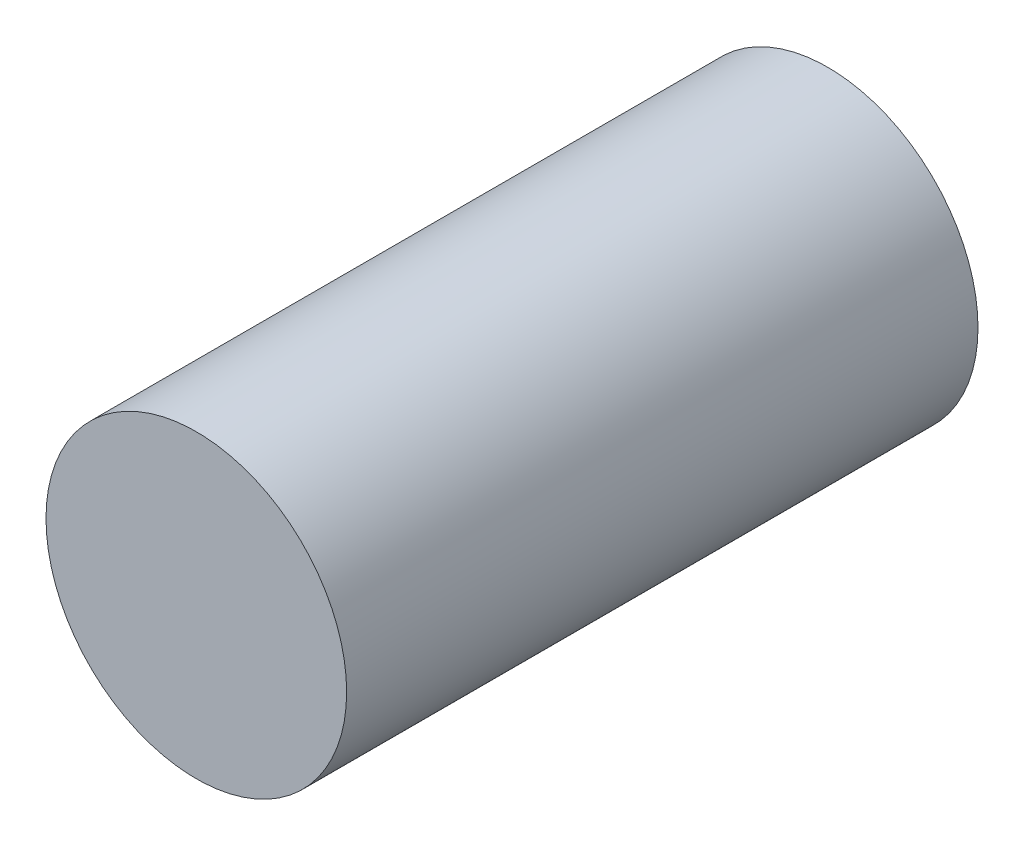
ISO-10303-21;
HEADER;
FILE_DESCRIPTION(('STEP AP214'),'2;1');
FILE_NAME('part.step','',(''),(''),'','','');
FILE_SCHEMA(('AUTOMOTIVE_DESIGN { 1 0 10303 214 1 1 1 1 }'));
ENDSEC;
DATA;
#1=APPLICATION_CONTEXT('core data for automotive mechanical design processes');
#2=APPLICATION_PROTOCOL_DEFINITION('international standard','automotive_design',2000,#1);
#3=PRODUCT_CONTEXT('',#1,'mechanical');
#4=PRODUCT('Part','Part','',(#3));
#5=PRODUCT_RELATED_PRODUCT_CATEGORY('part','',(#4));
#6=PRODUCT_DEFINITION_FORMATION('','',#4);
#7=PRODUCT_DEFINITION_CONTEXT('part definition',#1,'design');
#8=PRODUCT_DEFINITION('design','',#6,#7);
#9=PRODUCT_DEFINITION_SHAPE('','',#8);
#10=(LENGTH_UNIT() NAMED_UNIT(*) SI_UNIT(.MILLI.,.METRE.));
#11=(NAMED_UNIT(*) PLANE_ANGLE_UNIT() SI_UNIT($,.RADIAN.));
#12=(NAMED_UNIT(*) SI_UNIT($,.STERADIAN.) SOLID_ANGLE_UNIT());
#13=UNCERTAINTY_MEASURE_WITH_UNIT(LENGTH_MEASURE(1.E-05),#10,'distance_accuracy_value','');
#14=(GEOMETRIC_REPRESENTATION_CONTEXT(3) GLOBAL_UNCERTAINTY_ASSIGNED_CONTEXT((#13)) GLOBAL_UNIT_ASSIGNED_CONTEXT((#10,
#11,#12)) REPRESENTATION_CONTEXT('',''));
#15=CARTESIAN_POINT('',(0.,0.,0.));
#16=DIRECTION('',(0.,0.,1.));
#17=DIRECTION('',(1.,0.,0.));
#18=AXIS2_PLACEMENT_3D('',#15,#16,#17);
#19=CARTESIAN_POINT('',(0.,0.,31.5));
#20=DIRECTION('',(0.,0.,-1.));
#21=DIRECTION('',(-1.,0.,0.));
#22=AXIS2_PLACEMENT_3D('',#19,#20,#21);
#23=CYLINDRICAL_SURFACE('',#22,7.5);
#24=CARTESIAN_POINT('',(0.,0.,31.5));
#25=DIRECTION('',(0.,0.,1.));
#26=DIRECTION('',(1.,0.,0.));
#27=AXIS2_PLACEMENT_3D('',#24,#25,#26);
#28=CIRCLE('',#27,7.5);
#29=CARTESIAN_POINT('',(7.5,0.,31.5));
#30=VERTEX_POINT('',#29);
#31=EDGE_CURVE('E10',#30,#30,#28,.T.);
#32=ORIENTED_EDGE('',*,*,#31,.F.);
#33=EDGE_LOOP('',(#32));
#34=FACE_BOUND('',#33,.T.);
#35=CARTESIAN_POINT('',(0.,0.,0.));
#36=DIRECTION('',(0.,0.,1.));
#37=DIRECTION('',(1.,0.,0.));
#38=AXIS2_PLACEMENT_3D('',#35,#36,#37);
#39=CIRCLE('',#38,7.5);
#40=CARTESIAN_POINT('',(7.5,0.,0.));
#41=VERTEX_POINT('',#40);
#42=EDGE_CURVE('E48',#41,#41,#39,.T.);
#43=ORIENTED_EDGE('',*,*,#42,.T.);
#44=EDGE_LOOP('',(#43));
#45=FACE_BOUND('',#44,.T.);
#46=ADVANCED_FACE('F45',(#34,#45),#23,.T.);
#47=CARTESIAN_POINT('',(0.,0.,31.5));
#48=DIRECTION('',(0.,0.,1.));
#49=DIRECTION('',(1.,0.,0.));
#50=AXIS2_PLACEMENT_3D('',#47,#48,#49);
#51=PLANE('',#50);
#52=ORIENTED_EDGE('',*,*,#31,.T.);
#53=EDGE_LOOP('',(#52));
#54=FACE_BOUND('',#53,.T.);
#55=ADVANCED_FACE('F62',(#54),#51,.T.);
#56=CARTESIAN_POINT('',(0.,0.,0.));
#57=DIRECTION('',(0.,0.,1.));
#58=DIRECTION('',(1.,0.,0.));
#59=AXIS2_PLACEMENT_3D('',#56,#57,#58);
#60=PLANE('',#59);
#61=ORIENTED_EDGE('',*,*,#42,.F.);
#62=EDGE_LOOP('',(#61));
#63=FACE_BOUND('',#62,.T.);
#64=ADVANCED_FACE('F60',(#63),#60,.F.);
#65=CLOSED_SHELL('',(#46,#55,#64));
#66=MANIFOLD_SOLID_BREP('B2',#65);
#67=ADVANCED_BREP_SHAPE_REPRESENTATION('',(#18,#66),#14);
#68=SHAPE_DEFINITION_REPRESENTATION(#9,#67);
ENDSEC;
END-ISO-10303-21;
